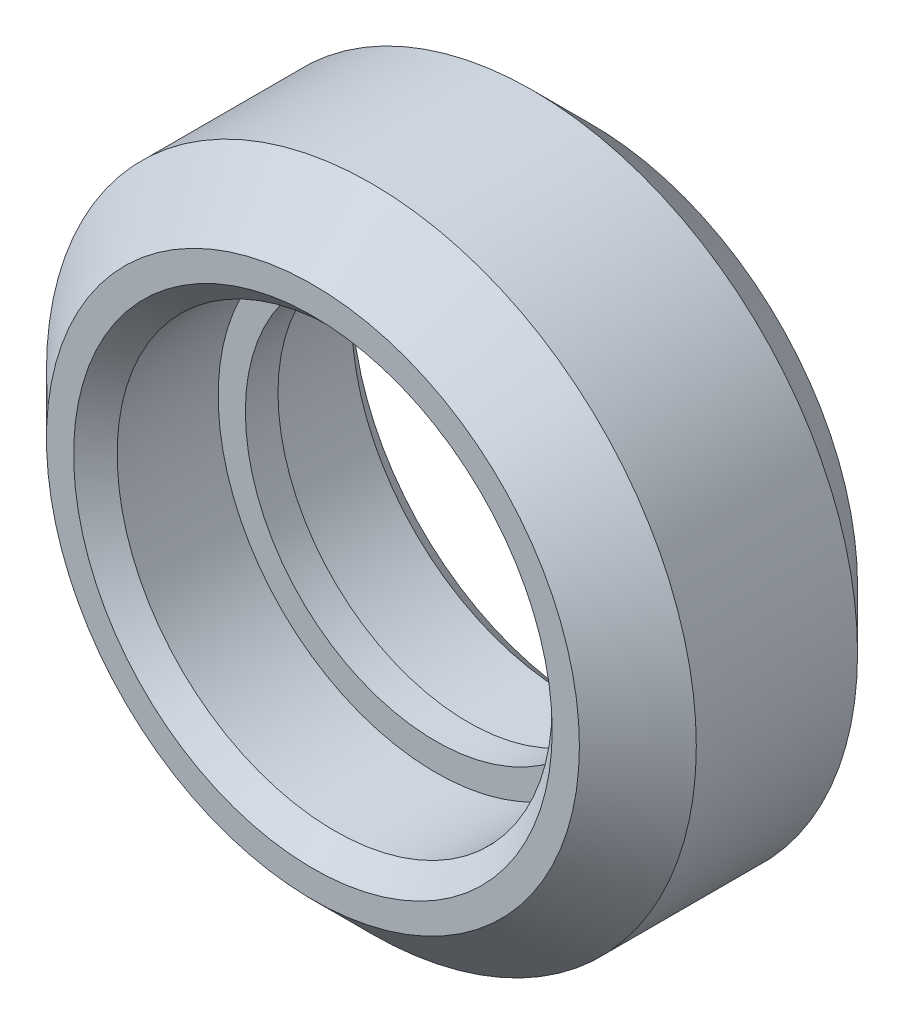
ISO-10303-21;
HEADER;
FILE_DESCRIPTION(('STEP AP214'),'2;1');
FILE_NAME('part.step','',(''),(''),'','','');
FILE_SCHEMA(('AUTOMOTIVE_DESIGN { 1 0 10303 214 1 1 1 1 }'));
ENDSEC;
DATA;
#1=APPLICATION_CONTEXT('core data for automotive mechanical design processes');
#2=APPLICATION_PROTOCOL_DEFINITION('international standard','automotive_design',2000,#1);
#3=PRODUCT_CONTEXT('',#1,'mechanical');
#4=PRODUCT('Part','Part','',(#3));
#5=PRODUCT_RELATED_PRODUCT_CATEGORY('part','',(#4));
#6=PRODUCT_DEFINITION_FORMATION('','',#4);
#7=PRODUCT_DEFINITION_CONTEXT('part definition',#1,'design');
#8=PRODUCT_DEFINITION('design','',#6,#7);
#9=PRODUCT_DEFINITION_SHAPE('','',#8);
#10=(LENGTH_UNIT() NAMED_UNIT(*) SI_UNIT(.MILLI.,.METRE.));
#11=(NAMED_UNIT(*) PLANE_ANGLE_UNIT() SI_UNIT($,.RADIAN.));
#12=(NAMED_UNIT(*) SI_UNIT($,.STERADIAN.) SOLID_ANGLE_UNIT());
#13=UNCERTAINTY_MEASURE_WITH_UNIT(LENGTH_MEASURE(1.E-05),#10,'distance_accuracy_value','');
#14=(GEOMETRIC_REPRESENTATION_CONTEXT(3) GLOBAL_UNCERTAINTY_ASSIGNED_CONTEXT((#13)) GLOBAL_UNIT_ASSIGNED_CONTEXT((#10,
#11,#12)) REPRESENTATION_CONTEXT('',''));
#15=CARTESIAN_POINT('',(0.,0.,0.));
#16=DIRECTION('',(0.,0.,1.));
#17=DIRECTION('',(1.,0.,0.));
#18=AXIS2_PLACEMENT_3D('',#15,#16,#17);
#19=CARTESIAN_POINT('',(0.,0.,0.));
#20=DIRECTION('',(0.,0.,1.));
#21=DIRECTION('',(1.,0.,0.));
#22=AXIS2_PLACEMENT_3D('',#19,#20,#21);
#23=CYLINDRICAL_SURFACE('',#22,7.);
#24=CARTESIAN_POINT('',(0.,0.,5.715));
#25=DIRECTION('',(0.,0.,1.));
#26=DIRECTION('',(1.,0.,0.));
#27=AXIS2_PLACEMENT_3D('',#24,#25,#26);
#28=CIRCLE('',#27,7.);
#29=CARTESIAN_POINT('',(7.00000000000001,0.,5.715));
#30=VERTEX_POINT('',#29);
#31=EDGE_CURVE('E60',#30,#30,#28,.F.);
#32=ORIENTED_EDGE('',*,*,#31,.F.);
#33=EDGE_LOOP('',(#32));
#34=FACE_BOUND('',#33,.T.);
#35=CARTESIAN_POINT('',(0.,0.,4.51499999999999));
#36=DIRECTION('',(0.,0.,-1.));
#37=DIRECTION('',(-1.,0.,0.));
#38=AXIS2_PLACEMENT_3D('',#35,#36,#37);
#39=CIRCLE('',#38,7.);
#40=CARTESIAN_POINT('',(-7.00000000000001,0.,4.51499999999999));
#41=VERTEX_POINT('',#40);
#42=EDGE_CURVE('E55',#41,#41,#39,.F.);
#43=ORIENTED_EDGE('',*,*,#42,.F.);
#44=EDGE_LOOP('',(#43));
#45=FACE_BOUND('',#44,.T.);
#46=ADVANCED_FACE('F34',(#34,#45),#23,.F.);
#47=CARTESIAN_POINT('',(0.,0.,10.23));
#48=DIRECTION('',(0.,0.,-1.));
#49=DIRECTION('',(-1.,0.,0.));
#50=AXIS2_PLACEMENT_3D('',#47,#48,#49);
#51=CYLINDRICAL_SURFACE('',#50,11.95);
#52=CARTESIAN_POINT('',(0.,0.,2.14999999999999));
#53=DIRECTION('',(0.,0.,1.));
#54=DIRECTION('',(1.,0.,0.));
#55=AXIS2_PLACEMENT_3D('',#52,#53,#54);
#56=CIRCLE('',#55,11.95);
#57=CARTESIAN_POINT('',(11.95,0.,2.14999999999999));
#58=VERTEX_POINT('',#57);
#59=EDGE_CURVE('E69',#58,#58,#56,.T.);
#60=ORIENTED_EDGE('',*,*,#59,.T.);
#61=EDGE_LOOP('',(#60));
#62=FACE_BOUND('',#61,.T.);
#63=CARTESIAN_POINT('',(0.,0.,8.07999999999999));
#64=DIRECTION('',(0.,0.,1.));
#65=DIRECTION('',(1.,0.,0.));
#66=AXIS2_PLACEMENT_3D('',#63,#64,#65);
#67=CIRCLE('',#66,11.95);
#68=CARTESIAN_POINT('',(11.95,0.,8.07999999999999));
#69=VERTEX_POINT('',#68);
#70=EDGE_CURVE('E63',#69,#69,#67,.F.);
#71=ORIENTED_EDGE('',*,*,#70,.T.);
#72=EDGE_LOOP('',(#71));
#73=FACE_BOUND('',#72,.T.);
#74=ADVANCED_FACE('F89',(#62,#73),#51,.T.);
#75=CARTESIAN_POINT('',(0.,0.,10.23));
#76=DIRECTION('',(0.,0.,1.));
#77=DIRECTION('',(1.,0.,0.));
#78=AXIS2_PLACEMENT_3D('',#75,#76,#77);
#79=PLANE('',#78);
#80=CARTESIAN_POINT('',(0.,0.,10.23));
#81=DIRECTION('',(0.,0.,1.));
#82=DIRECTION('',(1.,0.,0.));
#83=AXIS2_PLACEMENT_3D('',#80,#81,#82);
#84=CIRCLE('',#83,8.8);
#85=CARTESIAN_POINT('',(8.80000000000001,0.,10.23));
#86=VERTEX_POINT('',#85);
#87=EDGE_CURVE('E10',#86,#86,#84,.F.);
#88=ORIENTED_EDGE('',*,*,#87,.T.);
#89=EDGE_LOOP('',(#88));
#90=FACE_BOUND('',#89,.T.);
#91=CARTESIAN_POINT('',(0.,0.,10.23));
#92=DIRECTION('',(0.,0.,1.));
#93=DIRECTION('',(1.,0.,0.));
#94=AXIS2_PLACEMENT_3D('',#91,#92,#93);
#95=CIRCLE('',#94,9.8);
#96=CARTESIAN_POINT('',(9.80000000000001,0.,10.23));
#97=VERTEX_POINT('',#96);
#98=EDGE_CURVE('E54',#97,#97,#95,.T.);
#99=ORIENTED_EDGE('',*,*,#98,.T.);
#100=EDGE_LOOP('',(#99));
#101=FACE_BOUND('',#100,.T.);
#102=ADVANCED_FACE('F95',(#90,#101),#79,.T.);
#103=CARTESIAN_POINT('',(0.,0.,0.));
#104=DIRECTION('',(0.,0.,1.));
#105=DIRECTION('',(1.,0.,0.));
#106=AXIS2_PLACEMENT_3D('',#103,#104,#105);
#107=PLANE('',#106);
#108=CARTESIAN_POINT('',(0.,0.,0.));
#109=DIRECTION('',(0.,0.,1.));
#110=DIRECTION('',(1.,0.,0.));
#111=AXIS2_PLACEMENT_3D('',#108,#109,#110);
#112=CIRCLE('',#111,8.8);
#113=CARTESIAN_POINT('',(8.80000000000001,0.,0.));
#114=VERTEX_POINT('',#113);
#115=EDGE_CURVE('E49',#114,#114,#112,.T.);
#116=ORIENTED_EDGE('',*,*,#115,.T.);
#117=EDGE_LOOP('',(#116));
#118=FACE_BOUND('',#117,.T.);
#119=CARTESIAN_POINT('',(0.,0.,0.));
#120=DIRECTION('',(0.,0.,1.));
#121=DIRECTION('',(1.,0.,0.));
#122=AXIS2_PLACEMENT_3D('',#119,#120,#121);
#123=CIRCLE('',#122,9.8);
#124=CARTESIAN_POINT('',(9.8,0.,0.));
#125=VERTEX_POINT('',#124);
#126=EDGE_CURVE('E66',#125,#125,#123,.F.);
#127=ORIENTED_EDGE('',*,*,#126,.T.);
#128=EDGE_LOOP('',(#127));
#129=FACE_BOUND('',#128,.T.);
#130=ADVANCED_FACE('F104',(#118,#129),#107,.F.);
#131=CARTESIAN_POINT('',(0.,0.,2.14999999999999));
#132=DIRECTION('',(0.,0.,1.));
#133=DIRECTION('',(1.,0.,0.));
#134=AXIS2_PLACEMENT_3D('',#131,#132,#133);
#135=CONICAL_SURFACE('',#134,11.95,0.78539816339745);
#136=ORIENTED_EDGE('',*,*,#126,.F.);
#137=EDGE_LOOP('',(#136));
#138=FACE_BOUND('',#137,.T.);
#139=ORIENTED_EDGE('',*,*,#59,.F.);
#140=EDGE_LOOP('',(#139));
#141=FACE_BOUND('',#140,.T.);
#142=ADVANCED_FACE('F106',(#138,#141),#135,.T.);
#143=CARTESIAN_POINT('',(0.,0.,10.23));
#144=DIRECTION('',(0.,0.,-1.));
#145=DIRECTION('',(-1.,0.,0.));
#146=AXIS2_PLACEMENT_3D('',#143,#144,#145);
#147=CONICAL_SURFACE('',#146,9.8,0.785398163397447);
#148=ORIENTED_EDGE('',*,*,#70,.F.);
#149=EDGE_LOOP('',(#148));
#150=FACE_BOUND('',#149,.T.);
#151=ORIENTED_EDGE('',*,*,#98,.F.);
#152=EDGE_LOOP('',(#151));
#153=FACE_BOUND('',#152,.T.);
#154=ADVANCED_FACE('F111',(#150,#153),#147,.T.);
#155=CARTESIAN_POINT('',(0.,0.,5.715));
#156=DIRECTION('',(0.,0.,1.));
#157=DIRECTION('',(1.,0.,0.));
#158=AXIS2_PLACEMENT_3D('',#155,#156,#157);
#159=PLANE('',#158);
#160=CARTESIAN_POINT('',(0.,0.,5.715));
#161=DIRECTION('',(0.,0.,1.));
#162=DIRECTION('',(1.,0.,0.));
#163=AXIS2_PLACEMENT_3D('',#160,#161,#162);
#164=CIRCLE('',#163,8.);
#165=CARTESIAN_POINT('',(8.00000000000001,0.,5.715));
#166=VERTEX_POINT('',#165);
#167=EDGE_CURVE('E58',#166,#166,#164,.T.);
#168=ORIENTED_EDGE('',*,*,#167,.T.);
#169=EDGE_LOOP('',(#168));
#170=FACE_BOUND('',#169,.T.);
#171=ORIENTED_EDGE('',*,*,#31,.T.);
#172=EDGE_LOOP('',(#171));
#173=FACE_BOUND('',#172,.T.);
#174=ADVANCED_FACE('F114',(#170,#173),#159,.T.);
#175=CARTESIAN_POINT('',(0.,0.,5.715));
#176=DIRECTION('',(0.,0.,1.));
#177=DIRECTION('',(1.,0.,0.));
#178=AXIS2_PLACEMENT_3D('',#175,#176,#177);
#179=CYLINDRICAL_SURFACE('',#178,8.);
#180=CARTESIAN_POINT('',(0.,0.,9.43000000000001));
#181=DIRECTION('',(0.,0.,1.));
#182=DIRECTION('',(1.,0.,0.));
#183=AXIS2_PLACEMENT_3D('',#180,#181,#182);
#184=CIRCLE('',#183,8.);
#185=CARTESIAN_POINT('',(8.00000000000001,0.,9.43000000000001));
#186=VERTEX_POINT('',#185);
#187=EDGE_CURVE('E41',#186,#186,#184,.T.);
#188=ORIENTED_EDGE('',*,*,#187,.T.);
#189=EDGE_LOOP('',(#188));
#190=FACE_BOUND('',#189,.T.);
#191=ORIENTED_EDGE('',*,*,#167,.F.);
#192=EDGE_LOOP('',(#191));
#193=FACE_BOUND('',#192,.T.);
#194=ADVANCED_FACE('F84',(#190,#193),#179,.F.);
#195=CARTESIAN_POINT('',(0.,0.,4.51499999999999));
#196=DIRECTION('',(0.,0.,-1.));
#197=DIRECTION('',(1.,0.,0.));
#198=AXIS2_PLACEMENT_3D('',#195,#196,#197);
#199=PLANE('',#198);
#200=CARTESIAN_POINT('',(0.,0.,4.51499999999999));
#201=DIRECTION('',(0.,0.,1.));
#202=DIRECTION('',(1.,0.,0.));
#203=AXIS2_PLACEMENT_3D('',#200,#201,#202);
#204=CIRCLE('',#203,8.);
#205=CARTESIAN_POINT('',(8.00000000000001,0.,4.51499999999999));
#206=VERTEX_POINT('',#205);
#207=EDGE_CURVE('E59',#206,#206,#204,.T.);
#208=ORIENTED_EDGE('',*,*,#207,.F.);
#209=EDGE_LOOP('',(#208));
#210=FACE_BOUND('',#209,.T.);
#211=ORIENTED_EDGE('',*,*,#42,.T.);
#212=EDGE_LOOP('',(#211));
#213=FACE_BOUND('',#212,.T.);
#214=ADVANCED_FACE('F81',(#210,#213),#199,.T.);
#215=CARTESIAN_POINT('',(0.,0.,4.51499999999999));
#216=DIRECTION('',(0.,0.,-1.));
#217=DIRECTION('',(-1.,0.,0.));
#218=AXIS2_PLACEMENT_3D('',#215,#216,#217);
#219=CYLINDRICAL_SURFACE('',#218,8.);
#220=CARTESIAN_POINT('',(0.,0.,0.799999999999995));
#221=DIRECTION('',(0.,0.,1.));
#222=DIRECTION('',(1.,0.,0.));
#223=AXIS2_PLACEMENT_3D('',#220,#221,#222);
#224=CIRCLE('',#223,8.);
#225=CARTESIAN_POINT('',(8.00000000000001,0.,0.799999999999995));
#226=VERTEX_POINT('',#225);
#227=EDGE_CURVE('E45',#226,#226,#224,.F.);
#228=ORIENTED_EDGE('',*,*,#227,.T.);
#229=EDGE_LOOP('',(#228));
#230=FACE_BOUND('',#229,.T.);
#231=ORIENTED_EDGE('',*,*,#207,.T.);
#232=EDGE_LOOP('',(#231));
#233=FACE_BOUND('',#232,.T.);
#234=ADVANCED_FACE('F79',(#230,#233),#219,.F.);
#235=CARTESIAN_POINT('',(0.,0.,0.));
#236=DIRECTION('',(0.,0.,-1.));
#237=DIRECTION('',(-1.,0.,0.));
#238=AXIS2_PLACEMENT_3D('',#235,#236,#237);
#239=CONICAL_SURFACE('',#238,8.8,0.785398163397444);
#240=ORIENTED_EDGE('',*,*,#227,.F.);
#241=EDGE_LOOP('',(#240));
#242=FACE_BOUND('',#241,.T.);
#243=ORIENTED_EDGE('',*,*,#115,.F.);
#244=EDGE_LOOP('',(#243));
#245=FACE_BOUND('',#244,.T.);
#246=ADVANCED_FACE('F116',(#242,#245),#239,.F.);
#247=CARTESIAN_POINT('',(0.,0.,9.43000000000001));
#248=DIRECTION('',(0.,0.,1.));
#249=DIRECTION('',(1.,0.,0.));
#250=AXIS2_PLACEMENT_3D('',#247,#248,#249);
#251=CONICAL_SURFACE('',#250,8.,0.785398163397451);
#252=CARTESIAN_POINT('',(8.80000000000001,0.,10.23));
#253=CARTESIAN_POINT('',(8.79166666666667,0.,10.2216666666667));
#254=CARTESIAN_POINT('',(8.78333333333334,0.,10.2133333333333));
#255=CARTESIAN_POINT('',(8.76666666666667,0.,10.1966666666667));
#256=CARTESIAN_POINT('',(8.75833333333334,0.,10.1883333333333));
#257=CARTESIAN_POINT('',(8.74166666666667,0.,10.1716666666667));
#258=CARTESIAN_POINT('',(8.73333333333334,0.,10.1633333333333));
#259=CARTESIAN_POINT('',(8.71666666666667,0.,10.1466666666667));
#260=CARTESIAN_POINT('',(8.70833333333334,0.,10.1383333333333));
#261=CARTESIAN_POINT('',(8.69166666666667,0.,10.1216666666667));
#262=CARTESIAN_POINT('',(8.68333333333334,0.,10.1133333333333));
#263=CARTESIAN_POINT('',(8.66666666666667,0.,10.0966666666667));
#264=CARTESIAN_POINT('',(8.65833333333334,0.,10.0883333333333));
#265=CARTESIAN_POINT('',(8.64166666666667,0.,10.0716666666667));
#266=CARTESIAN_POINT('',(8.63333333333334,0.,10.0633333333333));
#267=CARTESIAN_POINT('',(8.61666666666667,0.,10.0466666666667));
#268=CARTESIAN_POINT('',(8.60833333333334,0.,10.0383333333333));
#269=CARTESIAN_POINT('',(8.59166666666667,0.,10.0216666666667));
#270=CARTESIAN_POINT('',(8.58333333333334,0.,10.0133333333333));
#271=CARTESIAN_POINT('',(8.56666666666667,0.,9.99666666666667));
#272=CARTESIAN_POINT('',(8.55833333333334,0.,9.98833333333334));
#273=CARTESIAN_POINT('',(8.54166666666667,0.,9.97166666666667));
#274=CARTESIAN_POINT('',(8.53333333333334,0.,9.96333333333334));
#275=CARTESIAN_POINT('',(8.51666666666667,0.,9.94666666666667));
#276=CARTESIAN_POINT('',(8.50833333333334,0.,9.93833333333334));
#277=CARTESIAN_POINT('',(8.49166666666667,0.,9.92166666666667));
#278=CARTESIAN_POINT('',(8.48333333333334,0.,9.91333333333334));
#279=CARTESIAN_POINT('',(8.46666666666667,0.,9.89666666666667));
#280=CARTESIAN_POINT('',(8.45833333333334,0.,9.88833333333334));
#281=CARTESIAN_POINT('',(8.44166666666667,0.,9.87166666666667));
#282=CARTESIAN_POINT('',(8.43333333333334,0.,9.86333333333334));
#283=CARTESIAN_POINT('',(8.41666666666667,0.,9.84666666666667));
#284=CARTESIAN_POINT('',(8.40833333333334,0.,9.83833333333334));
#285=CARTESIAN_POINT('',(8.39166666666667,0.,9.82166666666667));
#286=CARTESIAN_POINT('',(8.38333333333334,0.,9.81333333333334));
#287=CARTESIAN_POINT('',(8.36666666666667,0.,9.79666666666667));
#288=CARTESIAN_POINT('',(8.35833333333334,0.,9.78833333333334));
#289=CARTESIAN_POINT('',(8.34166666666667,0.,9.77166666666667));
#290=CARTESIAN_POINT('',(8.33333333333334,0.,9.76333333333334));
#291=CARTESIAN_POINT('',(8.31666666666667,0.,9.74666666666667));
#292=CARTESIAN_POINT('',(8.30833333333334,0.,9.73833333333334));
#293=CARTESIAN_POINT('',(8.29166666666667,0.,9.72166666666667));
#294=CARTESIAN_POINT('',(8.28333333333334,0.,9.71333333333334));
#295=CARTESIAN_POINT('',(8.26666666666667,0.,9.69666666666667));
#296=CARTESIAN_POINT('',(8.25833333333334,0.,9.68833333333334));
#297=CARTESIAN_POINT('',(8.24166666666667,0.,9.67166666666667));
#298=CARTESIAN_POINT('',(8.23333333333334,0.,9.66333333333334));
#299=CARTESIAN_POINT('',(8.21666666666667,0.,9.64666666666667));
#300=CARTESIAN_POINT('',(8.20833333333334,0.,9.63833333333334));
#301=CARTESIAN_POINT('',(8.19166666666667,0.,9.62166666666667));
#302=CARTESIAN_POINT('',(8.18333333333334,0.,9.61333333333334));
#303=CARTESIAN_POINT('',(8.16666666666667,0.,9.59666666666667));
#304=CARTESIAN_POINT('',(8.15833333333334,0.,9.58833333333334));
#305=CARTESIAN_POINT('',(8.14166666666667,0.,9.57166666666667));
#306=CARTESIAN_POINT('',(8.13333333333334,0.,9.56333333333334));
#307=CARTESIAN_POINT('',(8.11666666666667,0.,9.54666666666667));
#308=CARTESIAN_POINT('',(8.10833333333334,0.,9.53833333333334));
#309=CARTESIAN_POINT('',(8.09166666666667,0.,9.52166666666667));
#310=CARTESIAN_POINT('',(8.08333333333334,0.,9.51333333333334));
#311=CARTESIAN_POINT('',(8.06666666666667,0.,9.49666666666667));
#312=CARTESIAN_POINT('',(8.05833333333334,0.,9.48833333333334));
#313=CARTESIAN_POINT('',(8.04166666666667,0.,9.47166666666667));
#314=CARTESIAN_POINT('',(8.03333333333334,0.,9.46333333333334));
#315=CARTESIAN_POINT('',(8.01666666666667,0.,9.44666666666667));
#316=CARTESIAN_POINT('',(8.00833333333334,0.,9.43833333333334));
#317=CARTESIAN_POINT('',(8.00000000000001,0.,9.43000000000001));
#318=B_SPLINE_CURVE_WITH_KNOTS('',3,(#252,#253,#254,#255,#256,#257,#258,#259,#260,#261,#262,
#263,#264,#265,#266,#267,#268,#269,#270,#271,#272,#273,#274,#275,#276,#277,#278,#279,#280,#281,
#282,#283,#284,#285,#286,#287,#288,#289,#290,#291,#292,#293,#294,#295,#296,#297,#298,#299,#300,
#301,#302,#303,#304,#305,#306,#307,#308,#309,#310,#311,#312,#313,#314,#315,#316,#317),
.UNSPECIFIED.,.F.,.F.,(4,2,2,2,2,2,2,2,2,2,2,2,2,2,2,2,2,2,2,2,2,2,2,2,2,2,2,2,2,2,2,2,4),(0.,
0.0353553390593272,0.0707106781186556,0.106066017177981,0.14142135623731,0.176776695296637,
0.212132034355964,0.247487373415291,0.282842712474618,0.318198051533946,0.353553390593273,
0.3889087296526,0.424264068711928,0.459619407771254,0.494974746830583,0.530330085889909,
0.565685424949237,0.601040764008564,0.636396103067891,0.671751442127219,0.707106781186546,
0.742462120245873,0.777817459305201,0.813172798364527,0.848528137423856,0.883883476483182,
0.91923881554251,0.954594154601837,0.989949493661164,1.02530483272049,1.06066017177982,
1.09601551083915,1.13137084989847),.UNSPECIFIED.);
#319=EDGE_CURVE('BSEAM36',#86,#186,#318,.T.);
#320=ORIENTED_EDGE('',*,*,#87,.F.);
#321=ORIENTED_EDGE('',*,*,#187,.F.);
#322=ORIENTED_EDGE('',*,*,#319,.T.);
#323=ORIENTED_EDGE('',*,*,#319,.F.);
#324=EDGE_LOOP('',(#320,#322,#321,#323));
#325=FACE_BOUND('',#324,.T.);
#326=ADVANCED_FACE('F36',(#325),#251,.F.);
#327=CLOSED_SHELL('',(#46,#74,#102,#130,#142,#154,#174,#194,#214,#234,#246,#326));
#328=MANIFOLD_SOLID_BREP('B2',#327);
#329=ADVANCED_BREP_SHAPE_REPRESENTATION('',(#18,#328),#14);
#330=SHAPE_DEFINITION_REPRESENTATION(#9,#329);
ENDSEC;
END-ISO-10303-21;
